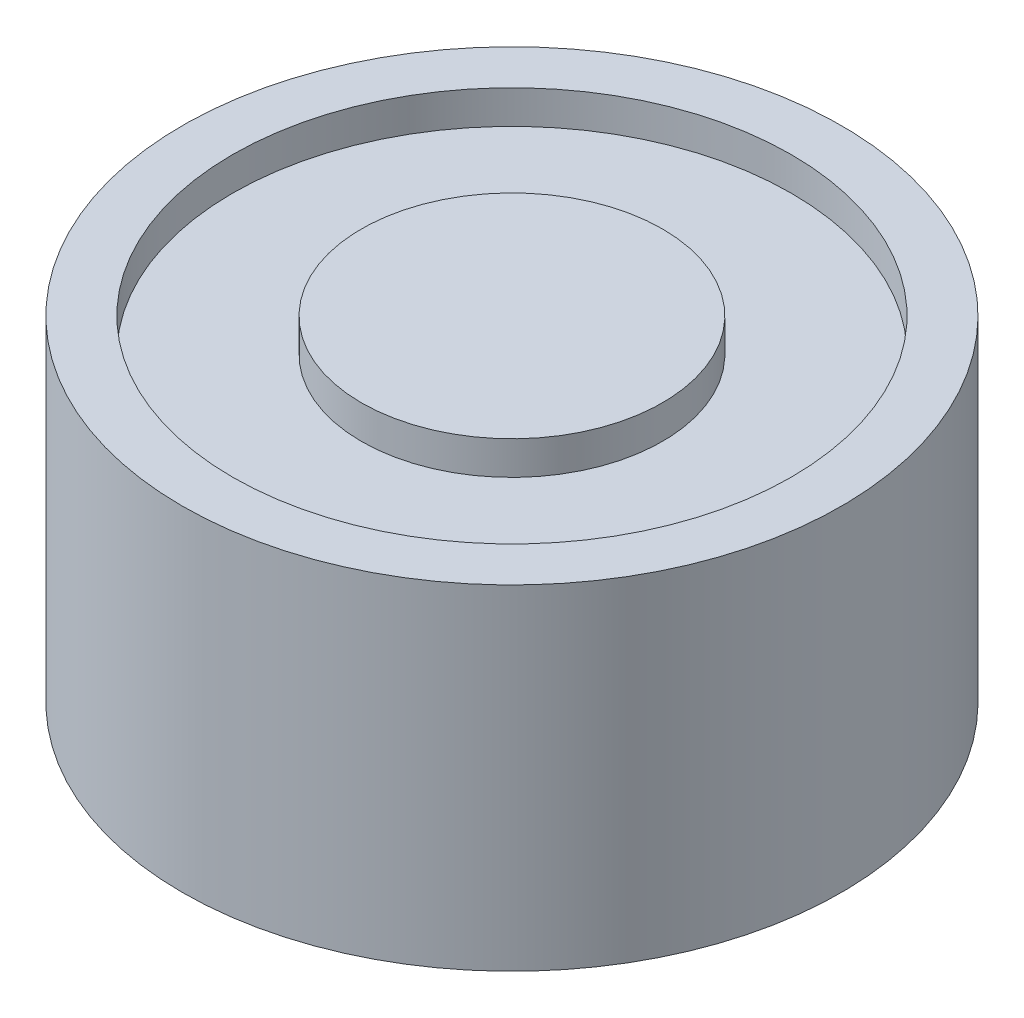
ISO-10303-21;
HEADER;
FILE_DESCRIPTION(('STEP AP214'),'2;1');
FILE_NAME('part.step','',(''),(''),'','','');
FILE_SCHEMA(('AUTOMOTIVE_DESIGN { 1 0 10303 214 1 1 1 1 }'));
ENDSEC;
DATA;
#1=APPLICATION_CONTEXT('core data for automotive mechanical design processes');
#2=APPLICATION_PROTOCOL_DEFINITION('international standard','automotive_design',2000,#1);
#3=PRODUCT_CONTEXT('',#1,'mechanical');
#4=PRODUCT('Part','Part','',(#3));
#5=PRODUCT_RELATED_PRODUCT_CATEGORY('part','',(#4));
#6=PRODUCT_DEFINITION_FORMATION('','',#4);
#7=PRODUCT_DEFINITION_CONTEXT('part definition',#1,'design');
#8=PRODUCT_DEFINITION('design','',#6,#7);
#9=PRODUCT_DEFINITION_SHAPE('','',#8);
#10=(LENGTH_UNIT() NAMED_UNIT(*) SI_UNIT(.MILLI.,.METRE.));
#11=(NAMED_UNIT(*) PLANE_ANGLE_UNIT() SI_UNIT($,.RADIAN.));
#12=(NAMED_UNIT(*) SI_UNIT($,.STERADIAN.) SOLID_ANGLE_UNIT());
#13=UNCERTAINTY_MEASURE_WITH_UNIT(LENGTH_MEASURE(1.E-05),#10,'distance_accuracy_value','');
#14=(GEOMETRIC_REPRESENTATION_CONTEXT(3) GLOBAL_UNCERTAINTY_ASSIGNED_CONTEXT((#13)) GLOBAL_UNIT_ASSIGNED_CONTEXT((#10,
#11,#12)) REPRESENTATION_CONTEXT('',''));
#15=CARTESIAN_POINT('',(0.,0.,0.));
#16=DIRECTION('',(0.,0.,1.));
#17=DIRECTION('',(1.,0.,0.));
#18=AXIS2_PLACEMENT_3D('',#15,#16,#17);
#19=CARTESIAN_POINT('',(0.,20.,0.));
#20=DIRECTION('',(0.,-1.,0.));
#21=DIRECTION('',(0.,0.,-1.));
#22=AXIS2_PLACEMENT_3D('',#19,#20,#21);
#23=CYLINDRICAL_SURFACE('',#22,19.7);
#24=CARTESIAN_POINT('',(0.,20.,0.));
#25=DIRECTION('',(0.,1.,0.));
#26=DIRECTION('',(0.,0.,1.));
#27=AXIS2_PLACEMENT_3D('',#24,#25,#26);
#28=CIRCLE('',#27,19.7);
#29=CARTESIAN_POINT('',(0.,20.,19.7));
#30=VERTEX_POINT('',#29);
#31=EDGE_CURVE('E10',#30,#30,#28,.T.);
#32=ORIENTED_EDGE('',*,*,#31,.F.);
#33=EDGE_LOOP('',(#32));
#34=FACE_BOUND('',#33,.T.);
#35=CARTESIAN_POINT('',(0.,0.,0.));
#36=DIRECTION('',(0.,1.,0.));
#37=DIRECTION('',(0.,0.,1.));
#38=AXIS2_PLACEMENT_3D('',#35,#36,#37);
#39=CIRCLE('',#38,19.7);
#40=CARTESIAN_POINT('',(0.,0.,19.7));
#41=VERTEX_POINT('',#40);
#42=EDGE_CURVE('E52',#41,#41,#39,.T.);
#43=ORIENTED_EDGE('',*,*,#42,.T.);
#44=EDGE_LOOP('',(#43));
#45=FACE_BOUND('',#44,.T.);
#46=ADVANCED_FACE('F49',(#34,#45),#23,.T.);
#47=CARTESIAN_POINT('',(0.,20.,0.));
#48=DIRECTION('',(0.,1.,0.));
#49=DIRECTION('',(0.,0.,1.));
#50=AXIS2_PLACEMENT_3D('',#47,#48,#49);
#51=PLANE('',#50);
#52=CARTESIAN_POINT('',(0.,20.,0.));
#53=DIRECTION('',(0.,1.,0.));
#54=DIRECTION('',(0.,0.,1.));
#55=AXIS2_PLACEMENT_3D('',#52,#53,#54);
#56=CIRCLE('',#55,16.7);
#57=CARTESIAN_POINT('',(0.,20.,16.7));
#58=VERTEX_POINT('',#57);
#59=EDGE_CURVE('E63',#58,#58,#56,.T.);
#60=ORIENTED_EDGE('',*,*,#59,.F.);
#61=EDGE_LOOP('',(#60));
#62=FACE_BOUND('',#61,.T.);
#63=ORIENTED_EDGE('',*,*,#31,.T.);
#64=EDGE_LOOP('',(#63));
#65=FACE_BOUND('',#64,.T.);
#66=ADVANCED_FACE('F95',(#62,#65),#51,.T.);
#67=CARTESIAN_POINT('',(0.,0.,0.));
#68=DIRECTION('',(0.,1.,0.));
#69=DIRECTION('',(0.,0.,1.));
#70=AXIS2_PLACEMENT_3D('',#67,#68,#69);
#71=PLANE('',#70);
#72=ORIENTED_EDGE('',*,*,#42,.F.);
#73=EDGE_LOOP('',(#72));
#74=FACE_BOUND('',#73,.T.);
#75=ADVANCED_FACE('F91',(#74),#71,.F.);
#76=CARTESIAN_POINT('',(0.,18.,0.));
#77=DIRECTION('',(0.,1.,0.));
#78=DIRECTION('',(0.,0.,1.));
#79=AXIS2_PLACEMENT_3D('',#76,#77,#78);
#80=CYLINDRICAL_SURFACE('',#79,16.7);
#81=CARTESIAN_POINT('',(0.,18.,0.));
#82=DIRECTION('',(0.,1.,0.));
#83=DIRECTION('',(0.,0.,1.));
#84=AXIS2_PLACEMENT_3D('',#81,#82,#83);
#85=CIRCLE('',#84,16.7);
#86=CARTESIAN_POINT('',(0.,18.,16.7));
#87=VERTEX_POINT('',#86);
#88=EDGE_CURVE('E61',#87,#87,#85,.T.);
#89=ORIENTED_EDGE('',*,*,#88,.F.);
#90=EDGE_LOOP('',(#89));
#91=FACE_BOUND('',#90,.T.);
#92=ORIENTED_EDGE('',*,*,#59,.T.);
#93=EDGE_LOOP('',(#92));
#94=FACE_BOUND('',#93,.T.);
#95=ADVANCED_FACE('F85',(#91,#94),#80,.F.);
#96=CARTESIAN_POINT('',(0.,18.,0.));
#97=DIRECTION('',(0.,1.,0.));
#98=DIRECTION('',(0.,0.,1.));
#99=AXIS2_PLACEMENT_3D('',#96,#97,#98);
#100=PLANE('',#99);
#101=CARTESIAN_POINT('',(0.,18.,0.));
#102=DIRECTION('',(0.,1.,0.));
#103=DIRECTION('',(0.,0.,1.));
#104=AXIS2_PLACEMENT_3D('',#101,#102,#103);
#105=CIRCLE('',#104,9.);
#106=CARTESIAN_POINT('',(0.,18.,9.));
#107=VERTEX_POINT('',#106);
#108=EDGE_CURVE('E67',#107,#107,#105,.T.);
#109=ORIENTED_EDGE('',*,*,#108,.F.);
#110=EDGE_LOOP('',(#109));
#111=FACE_BOUND('',#110,.T.);
#112=ORIENTED_EDGE('',*,*,#88,.T.);
#113=EDGE_LOOP('',(#112));
#114=FACE_BOUND('',#113,.T.);
#115=ADVANCED_FACE('F82',(#111,#114),#100,.T.);
#116=CARTESIAN_POINT('',(0.,18.,0.));
#117=DIRECTION('',(0.,1.,0.));
#118=DIRECTION('',(0.,0.,1.));
#119=AXIS2_PLACEMENT_3D('',#116,#117,#118);
#120=CYLINDRICAL_SURFACE('',#119,9.);
#121=ORIENTED_EDGE('',*,*,#108,.T.);
#122=EDGE_LOOP('',(#121));
#123=FACE_BOUND('',#122,.T.);
#124=CARTESIAN_POINT('',(0.,20.,0.));
#125=DIRECTION('',(0.,1.,0.));
#126=DIRECTION('',(0.,0.,1.));
#127=AXIS2_PLACEMENT_3D('',#124,#125,#126);
#128=CIRCLE('',#127,9.);
#129=CARTESIAN_POINT('',(0.,20.,9.));
#130=VERTEX_POINT('',#129);
#131=EDGE_CURVE('E71',#130,#130,#128,.T.);
#132=ORIENTED_EDGE('',*,*,#131,.F.);
#133=EDGE_LOOP('',(#132));
#134=FACE_BOUND('',#133,.T.);
#135=ADVANCED_FACE('F79',(#123,#134),#120,.T.);
#136=ORIENTED_EDGE('',*,*,#131,.T.);
#137=EDGE_LOOP('',(#136));
#138=FACE_BOUND('',#137,.T.);
#139=ADVANCED_FACE('F98',(#138),#51,.T.);
#140=CLOSED_SHELL('',(#46,#66,#75,#95,#115,#135,#139));
#141=MANIFOLD_SOLID_BREP('B2',#140);
#142=ADVANCED_BREP_SHAPE_REPRESENTATION('',(#18,#141),#14);
#143=SHAPE_DEFINITION_REPRESENTATION(#9,#142);
ENDSEC;
END-ISO-10303-21;
